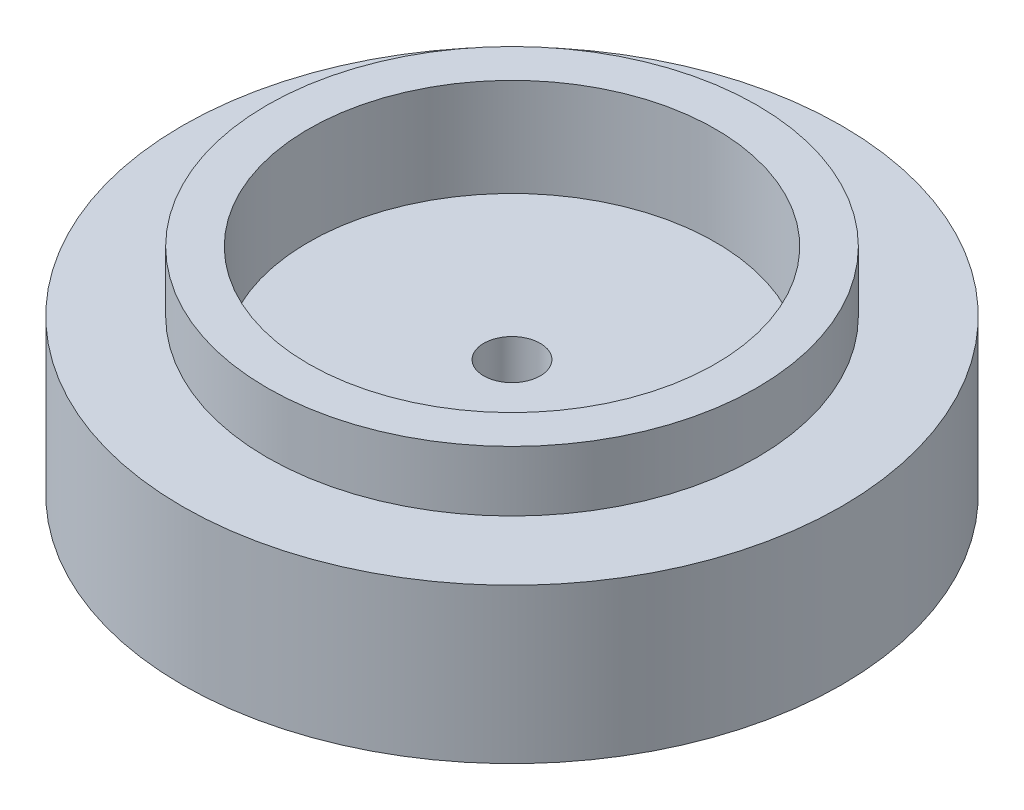
ISO-10303-21;
HEADER;
FILE_DESCRIPTION(('STEP AP214'),'2;1');
FILE_NAME('part.step','',(''),(''),'','','');
FILE_SCHEMA(('AUTOMOTIVE_DESIGN { 1 0 10303 214 1 1 1 1 }'));
ENDSEC;
DATA;
#1=APPLICATION_CONTEXT('core data for automotive mechanical design processes');
#2=APPLICATION_PROTOCOL_DEFINITION('international standard','automotive_design',2000,#1);
#3=PRODUCT_CONTEXT('',#1,'mechanical');
#4=PRODUCT('Part','Part','',(#3));
#5=PRODUCT_RELATED_PRODUCT_CATEGORY('part','',(#4));
#6=PRODUCT_DEFINITION_FORMATION('','',#4);
#7=PRODUCT_DEFINITION_CONTEXT('part definition',#1,'design');
#8=PRODUCT_DEFINITION('design','',#6,#7);
#9=PRODUCT_DEFINITION_SHAPE('','',#8);
#10=(LENGTH_UNIT() NAMED_UNIT(*) SI_UNIT(.MILLI.,.METRE.));
#11=(NAMED_UNIT(*) PLANE_ANGLE_UNIT() SI_UNIT($,.RADIAN.));
#12=(NAMED_UNIT(*) SI_UNIT($,.STERADIAN.) SOLID_ANGLE_UNIT());
#13=UNCERTAINTY_MEASURE_WITH_UNIT(LENGTH_MEASURE(1.E-05),#10,'distance_accuracy_value','');
#14=(GEOMETRIC_REPRESENTATION_CONTEXT(3) GLOBAL_UNCERTAINTY_ASSIGNED_CONTEXT((#13)) GLOBAL_UNIT_ASSIGNED_CONTEXT((#10,
#11,#12)) REPRESENTATION_CONTEXT('',''));
#15=CARTESIAN_POINT('',(0.,0.,0.));
#16=DIRECTION('',(0.,0.,1.));
#17=DIRECTION('',(1.,0.,0.));
#18=AXIS2_PLACEMENT_3D('',#15,#16,#17);
#19=CARTESIAN_POINT('',(0.,8.2,0.));
#20=DIRECTION('',(0.,1.,0.));
#21=DIRECTION('',(0.,0.,1.));
#22=AXIS2_PLACEMENT_3D('',#19,#20,#21);
#23=PLANE('',#22);
#24=CARTESIAN_POINT('',(0.,8.2,0.));
#25=DIRECTION('',(0.,1.,0.));
#26=DIRECTION('',(0.,0.,1.));
#27=AXIS2_PLACEMENT_3D('',#24,#25,#26);
#28=CIRCLE('',#27,17.5);
#29=CARTESIAN_POINT('',(0.,8.2,17.5));
#30=VERTEX_POINT('',#29);
#31=EDGE_CURVE('E35',#30,#30,#28,.T.);
#32=ORIENTED_EDGE('',*,*,#31,.T.);
#33=EDGE_LOOP('',(#32));
#34=FACE_BOUND('',#33,.T.);
#35=CARTESIAN_POINT('',(0.,8.2,0.));
#36=DIRECTION('',(0.,1.,0.));
#37=DIRECTION('',(0.,0.,1.));
#38=AXIS2_PLACEMENT_3D('',#35,#36,#37);
#39=CIRCLE('',#38,13.);
#40=CARTESIAN_POINT('',(0.,8.2,13.));
#41=VERTEX_POINT('',#40);
#42=EDGE_CURVE('E49',#41,#41,#39,.T.);
#43=ORIENTED_EDGE('',*,*,#42,.F.);
#44=EDGE_LOOP('',(#43));
#45=FACE_BOUND('',#44,.T.);
#46=ADVANCED_FACE('F28',(#34,#45),#23,.T.);
#47=CARTESIAN_POINT('',(0.,0.,0.));
#48=DIRECTION('',(0.,1.,0.));
#49=DIRECTION('',(0.,0.,1.));
#50=AXIS2_PLACEMENT_3D('',#47,#48,#49);
#51=PLANE('',#50);
#52=CARTESIAN_POINT('',(0.,0.,0.));
#53=DIRECTION('',(0.,1.,0.));
#54=DIRECTION('',(0.,0.,1.));
#55=AXIS2_PLACEMENT_3D('',#52,#53,#54);
#56=CIRCLE('',#55,17.5);
#57=CARTESIAN_POINT('',(0.,0.,17.5));
#58=VERTEX_POINT('',#57);
#59=EDGE_CURVE('E39',#58,#58,#56,.T.);
#60=ORIENTED_EDGE('',*,*,#59,.F.);
#61=EDGE_LOOP('',(#60));
#62=FACE_BOUND('',#61,.T.);
#63=CARTESIAN_POINT('',(0.,0.,0.));
#64=DIRECTION('',(0.,1.,0.));
#65=DIRECTION('',(0.,0.,1.));
#66=AXIS2_PLACEMENT_3D('',#63,#64,#65);
#67=CIRCLE('',#66,12.);
#68=CARTESIAN_POINT('',(0.,0.,12.));
#69=VERTEX_POINT('',#68);
#70=EDGE_CURVE('E10',#69,#69,#67,.F.);
#71=ORIENTED_EDGE('',*,*,#70,.F.);
#72=EDGE_LOOP('',(#71));
#73=FACE_BOUND('',#72,.T.);
#74=ADVANCED_FACE('F103',(#62,#73),#51,.F.);
#75=CARTESIAN_POINT('',(0.,8.2,0.));
#76=DIRECTION('',(0.,-1.,0.));
#77=DIRECTION('',(0.,0.,-1.));
#78=AXIS2_PLACEMENT_3D('',#75,#76,#77);
#79=CYLINDRICAL_SURFACE('',#78,17.5);
#80=ORIENTED_EDGE('',*,*,#31,.F.);
#81=EDGE_LOOP('',(#80));
#82=FACE_BOUND('',#81,.T.);
#83=ORIENTED_EDGE('',*,*,#59,.T.);
#84=EDGE_LOOP('',(#83));
#85=FACE_BOUND('',#84,.T.);
#86=ADVANCED_FACE('F30',(#82,#85),#79,.T.);
#87=CARTESIAN_POINT('',(0.,-2.,0.));
#88=DIRECTION('',(0.,1.,0.));
#89=DIRECTION('',(0.,0.,1.));
#90=AXIS2_PLACEMENT_3D('',#87,#88,#89);
#91=CYLINDRICAL_SURFACE('',#90,12.);
#92=CARTESIAN_POINT('',(0.,-2.,0.));
#93=DIRECTION('',(0.,-1.,0.));
#94=DIRECTION('',(0.,0.,-1.));
#95=AXIS2_PLACEMENT_3D('',#92,#93,#94);
#96=CIRCLE('',#95,12.);
#97=CARTESIAN_POINT('',(0.,-2.,-12.));
#98=VERTEX_POINT('',#97);
#99=EDGE_CURVE('E44',#98,#98,#96,.T.);
#100=ORIENTED_EDGE('',*,*,#99,.F.);
#101=EDGE_LOOP('',(#100));
#102=FACE_BOUND('',#101,.T.);
#103=ORIENTED_EDGE('',*,*,#70,.T.);
#104=EDGE_LOOP('',(#103));
#105=FACE_BOUND('',#104,.T.);
#106=ADVANCED_FACE('F110',(#102,#105),#91,.T.);
#107=CARTESIAN_POINT('',(0.,-2.,0.));
#108=DIRECTION('',(0.,-1.,0.));
#109=DIRECTION('',(0.,0.,-1.));
#110=AXIS2_PLACEMENT_3D('',#107,#108,#109);
#111=PLANE('',#110);
#112=CARTESIAN_POINT('',(0.,-2.,0.));
#113=DIRECTION('',(0.,-1.,0.));
#114=DIRECTION('',(0.,0.,-1.));
#115=AXIS2_PLACEMENT_3D('',#112,#113,#114);
#116=CIRCLE('',#115,10.8);
#117=CARTESIAN_POINT('',(0.,-2.,-10.8));
#118=VERTEX_POINT('',#117);
#119=EDGE_CURVE('E55',#118,#118,#116,.T.);
#120=ORIENTED_EDGE('',*,*,#119,.F.);
#121=EDGE_LOOP('',(#120));
#122=FACE_BOUND('',#121,.T.);
#123=ORIENTED_EDGE('',*,*,#99,.T.);
#124=EDGE_LOOP('',(#123));
#125=FACE_BOUND('',#124,.T.);
#126=ADVANCED_FACE('F98',(#122,#125),#111,.T.);
#127=CARTESIAN_POINT('',(0.,11.4,0.));
#128=DIRECTION('',(0.,-1.,0.));
#129=DIRECTION('',(0.,0.,-1.));
#130=AXIS2_PLACEMENT_3D('',#127,#128,#129);
#131=CYLINDRICAL_SURFACE('',#130,13.);
#132=CARTESIAN_POINT('',(0.,11.4,0.));
#133=DIRECTION('',(0.,1.,0.));
#134=DIRECTION('',(0.,0.,1.));
#135=AXIS2_PLACEMENT_3D('',#132,#133,#134);
#136=CIRCLE('',#135,13.);
#137=CARTESIAN_POINT('',(0.,11.4,13.));
#138=VERTEX_POINT('',#137);
#139=EDGE_CURVE('E48',#138,#138,#136,.T.);
#140=ORIENTED_EDGE('',*,*,#139,.F.);
#141=EDGE_LOOP('',(#140));
#142=FACE_BOUND('',#141,.T.);
#143=ORIENTED_EDGE('',*,*,#42,.T.);
#144=EDGE_LOOP('',(#143));
#145=FACE_BOUND('',#144,.T.);
#146=ADVANCED_FACE('F92',(#142,#145),#131,.T.);
#147=CARTESIAN_POINT('',(0.,11.4,0.));
#148=DIRECTION('',(0.,1.,0.));
#149=DIRECTION('',(0.,0.,1.));
#150=AXIS2_PLACEMENT_3D('',#147,#148,#149);
#151=PLANE('',#150);
#152=CARTESIAN_POINT('',(0.,11.4,0.));
#153=DIRECTION('',(0.,1.,0.));
#154=DIRECTION('',(0.,0.,1.));
#155=AXIS2_PLACEMENT_3D('',#152,#153,#154);
#156=CIRCLE('',#155,10.8);
#157=CARTESIAN_POINT('',(0.,11.4,10.8));
#158=VERTEX_POINT('',#157);
#159=EDGE_CURVE('E61',#158,#158,#156,.T.);
#160=ORIENTED_EDGE('',*,*,#159,.F.);
#161=EDGE_LOOP('',(#160));
#162=FACE_BOUND('',#161,.T.);
#163=ORIENTED_EDGE('',*,*,#139,.T.);
#164=EDGE_LOOP('',(#163));
#165=FACE_BOUND('',#164,.T.);
#166=ADVANCED_FACE('F88',(#162,#165),#151,.T.);
#167=CARTESIAN_POINT('',(0.,2.,0.));
#168=DIRECTION('',(0.,-1.,0.));
#169=DIRECTION('',(0.,0.,-1.));
#170=AXIS2_PLACEMENT_3D('',#167,#168,#169);
#171=CYLINDRICAL_SURFACE('',#170,10.8);
#172=CARTESIAN_POINT('',(0.,2.,0.));
#173=DIRECTION('',(0.,-1.,0.));
#174=DIRECTION('',(0.,0.,-1.));
#175=AXIS2_PLACEMENT_3D('',#172,#173,#174);
#176=CIRCLE('',#175,10.8);
#177=CARTESIAN_POINT('',(0.,2.,-10.8));
#178=VERTEX_POINT('',#177);
#179=EDGE_CURVE('E52',#178,#178,#176,.T.);
#180=ORIENTED_EDGE('',*,*,#179,.F.);
#181=EDGE_LOOP('',(#180));
#182=FACE_BOUND('',#181,.T.);
#183=ORIENTED_EDGE('',*,*,#119,.T.);
#184=EDGE_LOOP('',(#183));
#185=FACE_BOUND('',#184,.T.);
#186=ADVANCED_FACE('F91',(#182,#185),#171,.F.);
#187=CARTESIAN_POINT('',(0.,2.,0.));
#188=DIRECTION('',(0.,-1.,0.));
#189=DIRECTION('',(0.,0.,-1.));
#190=AXIS2_PLACEMENT_3D('',#187,#188,#189);
#191=PLANE('',#190);
#192=CARTESIAN_POINT('',(0.,2.,0.));
#193=DIRECTION('',(0.,-1.,0.));
#194=DIRECTION('',(0.,0.,-1.));
#195=AXIS2_PLACEMENT_3D('',#192,#193,#194);
#196=CIRCLE('',#195,1.5);
#197=CARTESIAN_POINT('',(0.,2.,-1.5));
#198=VERTEX_POINT('',#197);
#199=EDGE_CURVE('E64',#198,#198,#196,.T.);
#200=ORIENTED_EDGE('',*,*,#199,.F.);
#201=EDGE_LOOP('',(#200));
#202=FACE_BOUND('',#201,.T.);
#203=ORIENTED_EDGE('',*,*,#179,.T.);
#204=EDGE_LOOP('',(#203));
#205=FACE_BOUND('',#204,.T.);
#206=ADVANCED_FACE('F84',(#202,#205),#191,.T.);
#207=CARTESIAN_POINT('',(0.,6.2,0.));
#208=DIRECTION('',(0.,1.,0.));
#209=DIRECTION('',(0.,0.,1.));
#210=AXIS2_PLACEMENT_3D('',#207,#208,#209);
#211=CYLINDRICAL_SURFACE('',#210,10.8);
#212=CARTESIAN_POINT('',(0.,6.2,0.));
#213=DIRECTION('',(0.,1.,0.));
#214=DIRECTION('',(0.,0.,1.));
#215=AXIS2_PLACEMENT_3D('',#212,#213,#214);
#216=CIRCLE('',#215,10.8);
#217=CARTESIAN_POINT('',(0.,6.2,10.8));
#218=VERTEX_POINT('',#217);
#219=EDGE_CURVE('E58',#218,#218,#216,.T.);
#220=ORIENTED_EDGE('',*,*,#219,.F.);
#221=EDGE_LOOP('',(#220));
#222=FACE_BOUND('',#221,.T.);
#223=ORIENTED_EDGE('',*,*,#159,.T.);
#224=EDGE_LOOP('',(#223));
#225=FACE_BOUND('',#224,.T.);
#226=ADVANCED_FACE('F78',(#222,#225),#211,.F.);
#227=CARTESIAN_POINT('',(0.,6.2,0.));
#228=DIRECTION('',(0.,1.,0.));
#229=DIRECTION('',(0.,0.,1.));
#230=AXIS2_PLACEMENT_3D('',#227,#228,#229);
#231=PLANE('',#230);
#232=CARTESIAN_POINT('',(0.,6.2,0.));
#233=DIRECTION('',(0.,1.,0.));
#234=DIRECTION('',(0.,0.,1.));
#235=AXIS2_PLACEMENT_3D('',#232,#233,#234);
#236=CIRCLE('',#235,1.5);
#237=CARTESIAN_POINT('',(0.,6.2,1.5));
#238=VERTEX_POINT('',#237);
#239=EDGE_CURVE('E69',#238,#238,#236,.T.);
#240=ORIENTED_EDGE('',*,*,#239,.F.);
#241=EDGE_LOOP('',(#240));
#242=FACE_BOUND('',#241,.T.);
#243=ORIENTED_EDGE('',*,*,#219,.T.);
#244=EDGE_LOOP('',(#243));
#245=FACE_BOUND('',#244,.T.);
#246=ADVANCED_FACE('F75',(#242,#245),#231,.T.);
#247=CARTESIAN_POINT('',(0.,-2.,0.));
#248=DIRECTION('',(0.,1.,0.));
#249=DIRECTION('',(0.,0.,1.));
#250=AXIS2_PLACEMENT_3D('',#247,#248,#249);
#251=CYLINDRICAL_SURFACE('',#250,1.5);
#252=ORIENTED_EDGE('',*,*,#199,.T.);
#253=EDGE_LOOP('',(#252));
#254=FACE_BOUND('',#253,.T.);
#255=ORIENTED_EDGE('',*,*,#239,.T.);
#256=EDGE_LOOP('',(#255));
#257=FACE_BOUND('',#256,.T.);
#258=ADVANCED_FACE('F73',(#254,#257),#251,.F.);
#259=CLOSED_SHELL('',(#46,#74,#86,#106,#126,#146,#166,#186,#206,#226,#246,#258));
#260=MANIFOLD_SOLID_BREP('B2',#259);
#261=ADVANCED_BREP_SHAPE_REPRESENTATION('',(#18,#260),#14);
#262=SHAPE_DEFINITION_REPRESENTATION(#9,#261);
ENDSEC;
END-ISO-10303-21;
